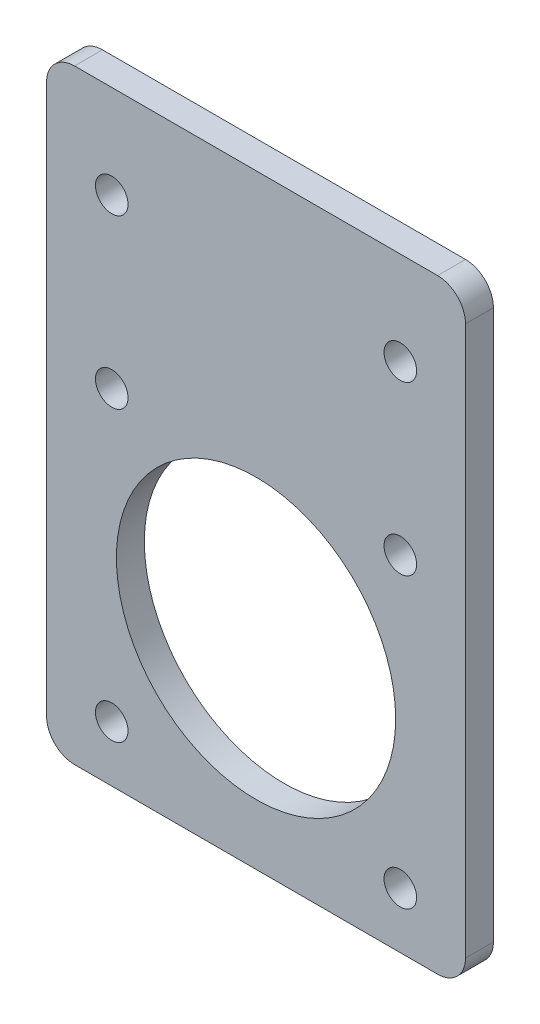
ISO-10303-21;
HEADER;
FILE_DESCRIPTION(('STEP AP214'),'2;1');
FILE_NAME('part.step','',(''),(''),'','','');
FILE_SCHEMA(('AUTOMOTIVE_DESIGN { 1 0 10303 214 1 1 1 1 }'));
ENDSEC;
DATA;
#1=APPLICATION_CONTEXT('core data for automotive mechanical design processes');
#2=APPLICATION_PROTOCOL_DEFINITION('international standard','automotive_design',2000,#1);
#3=PRODUCT_CONTEXT('',#1,'mechanical');
#4=PRODUCT('Part','Part','',(#3));
#5=PRODUCT_RELATED_PRODUCT_CATEGORY('part','',(#4));
#6=PRODUCT_DEFINITION_FORMATION('','',#4);
#7=PRODUCT_DEFINITION_CONTEXT('part definition',#1,'design');
#8=PRODUCT_DEFINITION('design','',#6,#7);
#9=PRODUCT_DEFINITION_SHAPE('','',#8);
#10=(LENGTH_UNIT() NAMED_UNIT(*) SI_UNIT(.MILLI.,.METRE.));
#11=(NAMED_UNIT(*) PLANE_ANGLE_UNIT() SI_UNIT($,.RADIAN.));
#12=(NAMED_UNIT(*) SI_UNIT($,.STERADIAN.) SOLID_ANGLE_UNIT());
#13=UNCERTAINTY_MEASURE_WITH_UNIT(LENGTH_MEASURE(1.E-05),#10,'distance_accuracy_value','');
#14=(GEOMETRIC_REPRESENTATION_CONTEXT(3) GLOBAL_UNCERTAINTY_ASSIGNED_CONTEXT((#13)) GLOBAL_UNIT_ASSIGNED_CONTEXT((#10,
#11,#12)) REPRESENTATION_CONTEXT('',''));
#15=CARTESIAN_POINT('',(0.,0.,0.));
#16=DIRECTION('',(0.,0.,1.));
#17=DIRECTION('',(1.,0.,0.));
#18=AXIS2_PLACEMENT_3D('',#15,#16,#17);
#19=CARTESIAN_POINT('',(-22.5,32.5,3.));
#20=DIRECTION('',(1.,0.,0.));
#21=DIRECTION('',(0.,1.,0.));
#22=AXIS2_PLACEMENT_3D('',#19,#20,#21);
#23=PLANE('',#22);
#24=DIRECTION('',(0.,-1.,0.));
#25=VECTOR('',#24,1.);
#26=CARTESIAN_POINT('',(-22.5,32.5,3.));
#27=LINE('',#26,#25);
#28=CARTESIAN_POINT('',(-22.5,29.5,3.));
#29=VERTEX_POINT('',#28);
#30=CARTESIAN_POINT('',(-22.5,-29.5,3.));
#31=VERTEX_POINT('',#30);
#32=EDGE_CURVE('E122',#29,#31,#27,.T.);
#33=ORIENTED_EDGE('',*,*,#32,.F.);
#34=DIRECTION('',(0.,0.,-1.));
#35=VECTOR('',#34,1.);
#36=CARTESIAN_POINT('',(-22.5,29.5,3.));
#37=LINE('',#36,#35);
#38=CARTESIAN_POINT('',(-22.5,29.5,0.));
#39=VERTEX_POINT('',#38);
#40=EDGE_CURVE('E107',#29,#39,#37,.T.);
#41=ORIENTED_EDGE('',*,*,#40,.T.);
#42=DIRECTION('',(0.,-1.,0.));
#43=VECTOR('',#42,1.);
#44=CARTESIAN_POINT('',(-22.5,32.5,0.));
#45=LINE('',#44,#43);
#46=CARTESIAN_POINT('',(-22.5,-29.5,0.));
#47=VERTEX_POINT('',#46);
#48=EDGE_CURVE('E119',#39,#47,#45,.T.);
#49=ORIENTED_EDGE('',*,*,#48,.T.);
#50=DIRECTION('',(0.,0.,-1.));
#51=VECTOR('',#50,1.);
#52=CARTESIAN_POINT('',(-22.5,-29.5,3.));
#53=LINE('',#52,#51);
#54=EDGE_CURVE('E124',#47,#31,#53,.F.);
#55=ORIENTED_EDGE('',*,*,#54,.T.);
#56=EDGE_LOOP('',(#33,#41,#49,#55));
#57=FACE_BOUND('',#56,.T.);
#58=ADVANCED_FACE('F35',(#57),#23,.F.);
#59=CARTESIAN_POINT('',(22.5,-32.5,3.));
#60=DIRECTION('',(0.,1.,0.));
#61=DIRECTION('',(-1.,0.,0.));
#62=AXIS2_PLACEMENT_3D('',#59,#60,#61);
#63=PLANE('',#62);
#64=DIRECTION('',(1.,0.,0.));
#65=VECTOR('',#64,1.);
#66=CARTESIAN_POINT('',(22.5,-32.5,0.));
#67=LINE('',#66,#65);
#68=CARTESIAN_POINT('',(-19.5,-32.5,0.));
#69=VERTEX_POINT('',#68);
#70=CARTESIAN_POINT('',(19.5,-32.5,0.));
#71=VERTEX_POINT('',#70);
#72=EDGE_CURVE('E128',#69,#71,#67,.T.);
#73=ORIENTED_EDGE('',*,*,#72,.T.);
#74=DIRECTION('',(0.,0.,-1.));
#75=VECTOR('',#74,1.);
#76=CARTESIAN_POINT('',(19.5,-32.5,3.));
#77=LINE('',#76,#75);
#78=CARTESIAN_POINT('',(19.5,-32.5,3.));
#79=VERTEX_POINT('',#78);
#80=EDGE_CURVE('E11',#71,#79,#77,.F.);
#81=ORIENTED_EDGE('',*,*,#80,.T.);
#82=DIRECTION('',(1.,0.,0.));
#83=VECTOR('',#82,1.);
#84=CARTESIAN_POINT('',(22.5,-32.5,3.));
#85=LINE('',#84,#83);
#86=CARTESIAN_POINT('',(-19.5,-32.5,3.));
#87=VERTEX_POINT('',#86);
#88=EDGE_CURVE('E204',#87,#79,#85,.T.);
#89=ORIENTED_EDGE('',*,*,#88,.F.);
#90=DIRECTION('',(0.,0.,-1.));
#91=VECTOR('',#90,1.);
#92=CARTESIAN_POINT('',(-19.5,-32.5,3.));
#93=LINE('',#92,#91);
#94=EDGE_CURVE('E44',#87,#69,#93,.T.);
#95=ORIENTED_EDGE('',*,*,#94,.T.);
#96=EDGE_LOOP('',(#73,#81,#89,#95));
#97=FACE_BOUND('',#96,.T.);
#98=ADVANCED_FACE('F222',(#97),#63,.F.);
#99=CARTESIAN_POINT('',(22.5,32.5,3.));
#100=DIRECTION('',(-1.,0.,0.));
#101=DIRECTION('',(0.,-1.,0.));
#102=AXIS2_PLACEMENT_3D('',#99,#100,#101);
#103=PLANE('',#102);
#104=DIRECTION('',(0.,1.,0.));
#105=VECTOR('',#104,1.);
#106=CARTESIAN_POINT('',(22.5,32.5,0.));
#107=LINE('',#106,#105);
#108=CARTESIAN_POINT('',(22.5,-29.5,0.));
#109=VERTEX_POINT('',#108);
#110=CARTESIAN_POINT('',(22.5,29.5,0.));
#111=VERTEX_POINT('',#110);
#112=EDGE_CURVE('E132',#109,#111,#107,.T.);
#113=ORIENTED_EDGE('',*,*,#112,.T.);
#114=DIRECTION('',(0.,0.,-1.));
#115=VECTOR('',#114,1.);
#116=CARTESIAN_POINT('',(22.5,29.5,3.));
#117=LINE('',#116,#115);
#118=CARTESIAN_POINT('',(22.5,29.5,3.));
#119=VERTEX_POINT('',#118);
#120=EDGE_CURVE('E52',#111,#119,#117,.F.);
#121=ORIENTED_EDGE('',*,*,#120,.T.);
#122=DIRECTION('',(0.,1.,0.));
#123=VECTOR('',#122,1.);
#124=CARTESIAN_POINT('',(22.5,32.5,3.));
#125=LINE('',#124,#123);
#126=CARTESIAN_POINT('',(22.5,-29.5,3.));
#127=VERTEX_POINT('',#126);
#128=EDGE_CURVE('E205',#127,#119,#125,.T.);
#129=ORIENTED_EDGE('',*,*,#128,.F.);
#130=DIRECTION('',(0.,0.,-1.));
#131=VECTOR('',#130,1.);
#132=CARTESIAN_POINT('',(22.5,-29.5,3.));
#133=LINE('',#132,#131);
#134=EDGE_CURVE('E159',#127,#109,#133,.T.);
#135=ORIENTED_EDGE('',*,*,#134,.T.);
#136=EDGE_LOOP('',(#113,#121,#129,#135));
#137=FACE_BOUND('',#136,.T.);
#138=ADVANCED_FACE('F216',(#137),#103,.F.);
#139=CARTESIAN_POINT('',(22.5,32.5,3.));
#140=DIRECTION('',(0.,-1.,0.));
#141=DIRECTION('',(0.,0.,-1.));
#142=AXIS2_PLACEMENT_3D('',#139,#140,#141);
#143=PLANE('',#142);
#144=DIRECTION('',(-1.,0.,0.));
#145=VECTOR('',#144,1.);
#146=CARTESIAN_POINT('',(22.5,32.5,0.));
#147=LINE('',#146,#145);
#148=CARTESIAN_POINT('',(19.5,32.5,0.));
#149=VERTEX_POINT('',#148);
#150=CARTESIAN_POINT('',(-19.5,32.5,0.));
#151=VERTEX_POINT('',#150);
#152=EDGE_CURVE('E142',#149,#151,#147,.T.);
#153=ORIENTED_EDGE('',*,*,#152,.T.);
#154=DIRECTION('',(0.,0.,-1.));
#155=VECTOR('',#154,1.);
#156=CARTESIAN_POINT('',(-19.5,32.5,3.));
#157=LINE('',#156,#155);
#158=CARTESIAN_POINT('',(-19.5,32.5,3.));
#159=VERTEX_POINT('',#158);
#160=EDGE_CURVE('E108',#151,#159,#157,.F.);
#161=ORIENTED_EDGE('',*,*,#160,.T.);
#162=DIRECTION('',(-1.,0.,0.));
#163=VECTOR('',#162,1.);
#164=CARTESIAN_POINT('',(22.5,32.5,3.));
#165=LINE('',#164,#163);
#166=CARTESIAN_POINT('',(19.5,32.5,3.));
#167=VERTEX_POINT('',#166);
#168=EDGE_CURVE('E138',#167,#159,#165,.T.);
#169=ORIENTED_EDGE('',*,*,#168,.F.);
#170=DIRECTION('',(0.,0.,-1.));
#171=VECTOR('',#170,1.);
#172=CARTESIAN_POINT('',(19.5,32.5,3.));
#173=LINE('',#172,#171);
#174=EDGE_CURVE('E113',#167,#149,#173,.T.);
#175=ORIENTED_EDGE('',*,*,#174,.T.);
#176=EDGE_LOOP('',(#153,#161,#169,#175));
#177=FACE_BOUND('',#176,.T.);
#178=ADVANCED_FACE('F212',(#177),#143,.F.);
#179=CARTESIAN_POINT('',(-22.5,-32.5,3.));
#180=DIRECTION('',(0.,0.,-1.));
#181=DIRECTION('',(-1.,0.,0.));
#182=AXIS2_PLACEMENT_3D('',#179,#180,#181);
#183=PLANE('',#182);
#184=CARTESIAN_POINT('',(0.,-11.,3.));
#185=DIRECTION('',(0.,0.,1.));
#186=DIRECTION('',(1.,0.,0.));
#187=AXIS2_PLACEMENT_3D('',#184,#185,#186);
#188=CIRCLE('',#187,15.);
#189=CARTESIAN_POINT('',(15.,-11.,3.));
#190=VERTEX_POINT('',#189);
#191=EDGE_CURVE('E192',#190,#190,#188,.T.);
#192=ORIENTED_EDGE('',*,*,#191,.F.);
#193=EDGE_LOOP('',(#192));
#194=FACE_BOUND('',#193,.T.);
#195=CARTESIAN_POINT('',(-15.5,22.5,3.));
#196=DIRECTION('',(0.,0.,1.));
#197=DIRECTION('',(1.,0.,0.));
#198=AXIS2_PLACEMENT_3D('',#195,#196,#197);
#199=CIRCLE('',#198,1.75);
#200=CARTESIAN_POINT('',(-13.75,22.5,3.));
#201=VERTEX_POINT('',#200);
#202=EDGE_CURVE('E182',#201,#201,#199,.T.);
#203=ORIENTED_EDGE('',*,*,#202,.F.);
#204=EDGE_LOOP('',(#203));
#205=FACE_BOUND('',#204,.T.);
#206=CARTESIAN_POINT('',(15.5,22.5,3.));
#207=DIRECTION('',(0.,0.,1.));
#208=DIRECTION('',(1.,0.,0.));
#209=AXIS2_PLACEMENT_3D('',#206,#207,#208);
#210=CIRCLE('',#209,1.75);
#211=CARTESIAN_POINT('',(17.25,22.5,3.));
#212=VERTEX_POINT('',#211);
#213=EDGE_CURVE('E179',#212,#212,#210,.T.);
#214=ORIENTED_EDGE('',*,*,#213,.F.);
#215=EDGE_LOOP('',(#214));
#216=FACE_BOUND('',#215,.T.);
#217=CARTESIAN_POINT('',(15.5,-26.5,3.));
#218=DIRECTION('',(0.,0.,1.));
#219=DIRECTION('',(1.,0.,0.));
#220=AXIS2_PLACEMENT_3D('',#217,#218,#219);
#221=CIRCLE('',#220,1.75);
#222=CARTESIAN_POINT('',(17.25,-26.5,3.));
#223=VERTEX_POINT('',#222);
#224=EDGE_CURVE('E176',#223,#223,#221,.T.);
#225=ORIENTED_EDGE('',*,*,#224,.F.);
#226=EDGE_LOOP('',(#225));
#227=FACE_BOUND('',#226,.T.);
#228=CARTESIAN_POINT('',(15.5,4.5,3.));
#229=DIRECTION('',(0.,0.,1.));
#230=DIRECTION('',(1.,0.,0.));
#231=AXIS2_PLACEMENT_3D('',#228,#229,#230);
#232=CIRCLE('',#231,1.75);
#233=CARTESIAN_POINT('',(17.25,4.5,3.));
#234=VERTEX_POINT('',#233);
#235=EDGE_CURVE('E172',#234,#234,#232,.T.);
#236=ORIENTED_EDGE('',*,*,#235,.F.);
#237=EDGE_LOOP('',(#236));
#238=FACE_BOUND('',#237,.T.);
#239=CARTESIAN_POINT('',(-15.5,4.5,3.));
#240=DIRECTION('',(0.,0.,1.));
#241=DIRECTION('',(1.,0.,0.));
#242=AXIS2_PLACEMENT_3D('',#239,#240,#241);
#243=CIRCLE('',#242,1.75);
#244=CARTESIAN_POINT('',(-13.75,4.5,3.));
#245=VERTEX_POINT('',#244);
#246=EDGE_CURVE('E168',#245,#245,#243,.T.);
#247=ORIENTED_EDGE('',*,*,#246,.F.);
#248=EDGE_LOOP('',(#247));
#249=FACE_BOUND('',#248,.T.);
#250=CARTESIAN_POINT('',(-15.5,-26.5,3.));
#251=DIRECTION('',(0.,0.,1.));
#252=DIRECTION('',(1.,0.,0.));
#253=AXIS2_PLACEMENT_3D('',#250,#251,#252);
#254=CIRCLE('',#253,1.75);
#255=CARTESIAN_POINT('',(-13.75,-26.5,3.));
#256=VERTEX_POINT('',#255);
#257=EDGE_CURVE('E135',#256,#256,#254,.T.);
#258=ORIENTED_EDGE('',*,*,#257,.F.);
#259=EDGE_LOOP('',(#258));
#260=FACE_BOUND('',#259,.T.);
#261=ORIENTED_EDGE('',*,*,#168,.T.);
#262=CARTESIAN_POINT('',(-19.5,29.5,3.));
#263=DIRECTION('',(0.,0.,-1.));
#264=DIRECTION('',(-1.,0.,0.));
#265=AXIS2_PLACEMENT_3D('',#262,#263,#264);
#266=CIRCLE('',#265,3.);
#267=EDGE_CURVE('E157',#159,#29,#266,.F.);
#268=ORIENTED_EDGE('',*,*,#267,.T.);
#269=ORIENTED_EDGE('',*,*,#32,.T.);
#270=CARTESIAN_POINT('',(-19.5,-29.5,3.));
#271=DIRECTION('',(0.,0.,-1.));
#272=DIRECTION('',(-1.,0.,0.));
#273=AXIS2_PLACEMENT_3D('',#270,#271,#272);
#274=CIRCLE('',#273,3.);
#275=EDGE_CURVE('E152',#31,#87,#274,.F.);
#276=ORIENTED_EDGE('',*,*,#275,.T.);
#277=ORIENTED_EDGE('',*,*,#88,.T.);
#278=CARTESIAN_POINT('',(19.5,-29.5,3.));
#279=DIRECTION('',(0.,0.,-1.));
#280=DIRECTION('',(-1.,0.,0.));
#281=AXIS2_PLACEMENT_3D('',#278,#279,#280);
#282=CIRCLE('',#281,3.);
#283=EDGE_CURVE('E59',#79,#127,#282,.F.);
#284=ORIENTED_EDGE('',*,*,#283,.T.);
#285=ORIENTED_EDGE('',*,*,#128,.T.);
#286=CARTESIAN_POINT('',(19.5,29.5,3.));
#287=DIRECTION('',(0.,0.,-1.));
#288=DIRECTION('',(-1.,0.,0.));
#289=AXIS2_PLACEMENT_3D('',#286,#287,#288);
#290=CIRCLE('',#289,3.);
#291=EDGE_CURVE('E155',#119,#167,#290,.F.);
#292=ORIENTED_EDGE('',*,*,#291,.T.);
#293=EDGE_LOOP('',(#261,#268,#269,#276,#277,#284,#285,#292));
#294=FACE_BOUND('',#293,.T.);
#295=ADVANCED_FACE('F209',(#194,#205,#216,#227,#238,#249,#260,#294),#183,.F.);
#296=CARTESIAN_POINT('',(-22.5,-32.5,0.));
#297=DIRECTION('',(0.,0.,-1.));
#298=DIRECTION('',(-1.,0.,0.));
#299=AXIS2_PLACEMENT_3D('',#296,#297,#298);
#300=PLANE('',#299);
#301=CARTESIAN_POINT('',(0.,-11.,0.));
#302=DIRECTION('',(0.,0.,-1.));
#303=DIRECTION('',(-1.,0.,0.));
#304=AXIS2_PLACEMENT_3D('',#301,#302,#303);
#305=CIRCLE('',#304,15.);
#306=CARTESIAN_POINT('',(-15.,-11.,0.));
#307=VERTEX_POINT('',#306);
#308=EDGE_CURVE('E39',#307,#307,#305,.T.);
#309=ORIENTED_EDGE('',*,*,#308,.F.);
#310=EDGE_LOOP('',(#309));
#311=FACE_BOUND('',#310,.T.);
#312=CARTESIAN_POINT('',(-15.5,22.5,0.));
#313=DIRECTION('',(0.,0.,-1.));
#314=DIRECTION('',(-1.,0.,0.));
#315=AXIS2_PLACEMENT_3D('',#312,#313,#314);
#316=CIRCLE('',#315,1.75);
#317=CARTESIAN_POINT('',(-17.25,22.5,0.));
#318=VERTEX_POINT('',#317);
#319=EDGE_CURVE('E180',#318,#318,#316,.T.);
#320=ORIENTED_EDGE('',*,*,#319,.F.);
#321=EDGE_LOOP('',(#320));
#322=FACE_BOUND('',#321,.T.);
#323=CARTESIAN_POINT('',(15.5,22.5,0.));
#324=DIRECTION('',(0.,0.,-1.));
#325=DIRECTION('',(-1.,0.,0.));
#326=AXIS2_PLACEMENT_3D('',#323,#324,#325);
#327=CIRCLE('',#326,1.75);
#328=CARTESIAN_POINT('',(13.75,22.5,0.));
#329=VERTEX_POINT('',#328);
#330=EDGE_CURVE('E177',#329,#329,#327,.T.);
#331=ORIENTED_EDGE('',*,*,#330,.F.);
#332=EDGE_LOOP('',(#331));
#333=FACE_BOUND('',#332,.T.);
#334=CARTESIAN_POINT('',(15.5,-26.5,0.));
#335=DIRECTION('',(0.,0.,-1.));
#336=DIRECTION('',(-1.,0.,0.));
#337=AXIS2_PLACEMENT_3D('',#334,#335,#336);
#338=CIRCLE('',#337,1.75);
#339=CARTESIAN_POINT('',(13.75,-26.5,0.));
#340=VERTEX_POINT('',#339);
#341=EDGE_CURVE('E173',#340,#340,#338,.T.);
#342=ORIENTED_EDGE('',*,*,#341,.F.);
#343=EDGE_LOOP('',(#342));
#344=FACE_BOUND('',#343,.T.);
#345=CARTESIAN_POINT('',(15.5,4.5,0.));
#346=DIRECTION('',(0.,0.,-1.));
#347=DIRECTION('',(-1.,0.,0.));
#348=AXIS2_PLACEMENT_3D('',#345,#346,#347);
#349=CIRCLE('',#348,1.75);
#350=CARTESIAN_POINT('',(13.75,4.5,0.));
#351=VERTEX_POINT('',#350);
#352=EDGE_CURVE('E169',#351,#351,#349,.T.);
#353=ORIENTED_EDGE('',*,*,#352,.F.);
#354=EDGE_LOOP('',(#353));
#355=FACE_BOUND('',#354,.T.);
#356=CARTESIAN_POINT('',(-15.5,4.5,0.));
#357=DIRECTION('',(0.,0.,-1.));
#358=DIRECTION('',(-1.,0.,0.));
#359=AXIS2_PLACEMENT_3D('',#356,#357,#358);
#360=CIRCLE('',#359,1.75);
#361=CARTESIAN_POINT('',(-17.25,4.5,0.));
#362=VERTEX_POINT('',#361);
#363=EDGE_CURVE('E165',#362,#362,#360,.T.);
#364=ORIENTED_EDGE('',*,*,#363,.F.);
#365=EDGE_LOOP('',(#364));
#366=FACE_BOUND('',#365,.T.);
#367=CARTESIAN_POINT('',(-15.5,-26.5,0.));
#368=DIRECTION('',(0.,0.,-1.));
#369=DIRECTION('',(-1.,0.,0.));
#370=AXIS2_PLACEMENT_3D('',#367,#368,#369);
#371=CIRCLE('',#370,1.75);
#372=CARTESIAN_POINT('',(-17.25,-26.5,0.));
#373=VERTEX_POINT('',#372);
#374=EDGE_CURVE('E129',#373,#373,#371,.T.);
#375=ORIENTED_EDGE('',*,*,#374,.F.);
#376=EDGE_LOOP('',(#375));
#377=FACE_BOUND('',#376,.T.);
#378=ORIENTED_EDGE('',*,*,#48,.F.);
#379=CARTESIAN_POINT('',(-19.5,29.5,0.));
#380=DIRECTION('',(0.,0.,-1.));
#381=DIRECTION('',(-1.,0.,0.));
#382=AXIS2_PLACEMENT_3D('',#379,#380,#381);
#383=CIRCLE('',#382,3.);
#384=EDGE_CURVE('E103',#39,#151,#383,.T.);
#385=ORIENTED_EDGE('',*,*,#384,.T.);
#386=ORIENTED_EDGE('',*,*,#152,.F.);
#387=CARTESIAN_POINT('',(19.5,29.5,0.));
#388=DIRECTION('',(0.,0.,-1.));
#389=DIRECTION('',(-1.,0.,0.));
#390=AXIS2_PLACEMENT_3D('',#387,#388,#389);
#391=CIRCLE('',#390,3.);
#392=EDGE_CURVE('E114',#149,#111,#391,.T.);
#393=ORIENTED_EDGE('',*,*,#392,.T.);
#394=ORIENTED_EDGE('',*,*,#112,.F.);
#395=CARTESIAN_POINT('',(19.5,-29.5,0.));
#396=DIRECTION('',(0.,0.,-1.));
#397=DIRECTION('',(-1.,0.,0.));
#398=AXIS2_PLACEMENT_3D('',#395,#396,#397);
#399=CIRCLE('',#398,3.);
#400=EDGE_CURVE('E146',#109,#71,#399,.T.);
#401=ORIENTED_EDGE('',*,*,#400,.T.);
#402=ORIENTED_EDGE('',*,*,#72,.F.);
#403=CARTESIAN_POINT('',(-19.5,-29.5,0.));
#404=DIRECTION('',(0.,0.,-1.));
#405=DIRECTION('',(-1.,0.,0.));
#406=AXIS2_PLACEMENT_3D('',#403,#404,#405);
#407=CIRCLE('',#406,3.);
#408=EDGE_CURVE('E123',#69,#47,#407,.T.);
#409=ORIENTED_EDGE('',*,*,#408,.T.);
#410=EDGE_LOOP('',(#378,#385,#386,#393,#394,#401,#402,#409));
#411=FACE_BOUND('',#410,.T.);
#412=ADVANCED_FACE('F126',(#311,#322,#333,#344,#355,#366,#377,#411),#300,.T.);
#413=CARTESIAN_POINT('',(-19.5,29.5,3.));
#414=DIRECTION('',(0.,0.,-1.));
#415=DIRECTION('',(-1.,0.,0.));
#416=AXIS2_PLACEMENT_3D('',#413,#414,#415);
#417=CYLINDRICAL_SURFACE('',#416,3.);
#418=ORIENTED_EDGE('',*,*,#267,.F.);
#419=ORIENTED_EDGE('',*,*,#160,.F.);
#420=ORIENTED_EDGE('',*,*,#384,.F.);
#421=ORIENTED_EDGE('',*,*,#40,.F.);
#422=EDGE_LOOP('',(#418,#419,#420,#421));
#423=FACE_BOUND('',#422,.T.);
#424=ADVANCED_FACE('F106',(#423),#417,.T.);
#425=CARTESIAN_POINT('',(19.5,29.5,3.));
#426=DIRECTION('',(0.,0.,-1.));
#427=DIRECTION('',(-1.,0.,0.));
#428=AXIS2_PLACEMENT_3D('',#425,#426,#427);
#429=CYLINDRICAL_SURFACE('',#428,3.);
#430=ORIENTED_EDGE('',*,*,#291,.F.);
#431=ORIENTED_EDGE('',*,*,#120,.F.);
#432=ORIENTED_EDGE('',*,*,#392,.F.);
#433=ORIENTED_EDGE('',*,*,#174,.F.);
#434=EDGE_LOOP('',(#430,#431,#432,#433));
#435=FACE_BOUND('',#434,.T.);
#436=ADVANCED_FACE('F214',(#435),#429,.T.);
#437=CARTESIAN_POINT('',(19.5,-29.5,3.));
#438=DIRECTION('',(0.,0.,-1.));
#439=DIRECTION('',(-1.,0.,0.));
#440=AXIS2_PLACEMENT_3D('',#437,#438,#439);
#441=CYLINDRICAL_SURFACE('',#440,3.);
#442=ORIENTED_EDGE('',*,*,#283,.F.);
#443=ORIENTED_EDGE('',*,*,#80,.F.);
#444=ORIENTED_EDGE('',*,*,#400,.F.);
#445=ORIENTED_EDGE('',*,*,#134,.F.);
#446=EDGE_LOOP('',(#442,#443,#444,#445));
#447=FACE_BOUND('',#446,.T.);
#448=ADVANCED_FACE('F219',(#447),#441,.T.);
#449=CARTESIAN_POINT('',(-19.5,-29.5,3.));
#450=DIRECTION('',(0.,0.,-1.));
#451=DIRECTION('',(-1.,0.,0.));
#452=AXIS2_PLACEMENT_3D('',#449,#450,#451);
#453=CYLINDRICAL_SURFACE('',#452,3.);
#454=ORIENTED_EDGE('',*,*,#275,.F.);
#455=ORIENTED_EDGE('',*,*,#54,.F.);
#456=ORIENTED_EDGE('',*,*,#408,.F.);
#457=ORIENTED_EDGE('',*,*,#94,.F.);
#458=EDGE_LOOP('',(#454,#455,#456,#457));
#459=FACE_BOUND('',#458,.T.);
#460=ADVANCED_FACE('F37',(#459),#453,.T.);
#461=CARTESIAN_POINT('',(-15.5,-26.5,-9.));
#462=DIRECTION('',(0.,0.,1.));
#463=DIRECTION('',(1.,0.,0.));
#464=AXIS2_PLACEMENT_3D('',#461,#462,#463);
#465=CYLINDRICAL_SURFACE('',#464,1.75);
#466=ORIENTED_EDGE('',*,*,#374,.T.);
#467=EDGE_LOOP('',(#466));
#468=FACE_BOUND('',#467,.T.);
#469=ORIENTED_EDGE('',*,*,#257,.T.);
#470=EDGE_LOOP('',(#469));
#471=FACE_BOUND('',#470,.T.);
#472=ADVANCED_FACE('F228',(#468,#471),#465,.F.);
#473=CARTESIAN_POINT('',(-15.5,4.5,-9.));
#474=DIRECTION('',(0.,0.,1.));
#475=DIRECTION('',(1.,0.,0.));
#476=AXIS2_PLACEMENT_3D('',#473,#474,#475);
#477=CYLINDRICAL_SURFACE('',#476,1.75);
#478=ORIENTED_EDGE('',*,*,#363,.T.);
#479=EDGE_LOOP('',(#478));
#480=FACE_BOUND('',#479,.T.);
#481=ORIENTED_EDGE('',*,*,#246,.T.);
#482=EDGE_LOOP('',(#481));
#483=FACE_BOUND('',#482,.T.);
#484=ADVANCED_FACE('F233',(#480,#483),#477,.F.);
#485=CARTESIAN_POINT('',(15.5,4.5,-9.));
#486=DIRECTION('',(0.,0.,1.));
#487=DIRECTION('',(1.,0.,0.));
#488=AXIS2_PLACEMENT_3D('',#485,#486,#487);
#489=CYLINDRICAL_SURFACE('',#488,1.75);
#490=ORIENTED_EDGE('',*,*,#352,.T.);
#491=EDGE_LOOP('',(#490));
#492=FACE_BOUND('',#491,.T.);
#493=ORIENTED_EDGE('',*,*,#235,.T.);
#494=EDGE_LOOP('',(#493));
#495=FACE_BOUND('',#494,.T.);
#496=ADVANCED_FACE('F295',(#492,#495),#489,.F.);
#497=CARTESIAN_POINT('',(15.5,-26.5,-9.));
#498=DIRECTION('',(0.,0.,1.));
#499=DIRECTION('',(1.,0.,0.));
#500=AXIS2_PLACEMENT_3D('',#497,#498,#499);
#501=CYLINDRICAL_SURFACE('',#500,1.75);
#502=ORIENTED_EDGE('',*,*,#341,.T.);
#503=EDGE_LOOP('',(#502));
#504=FACE_BOUND('',#503,.T.);
#505=ORIENTED_EDGE('',*,*,#224,.T.);
#506=EDGE_LOOP('',(#505));
#507=FACE_BOUND('',#506,.T.);
#508=ADVANCED_FACE('F305',(#504,#507),#501,.F.);
#509=CARTESIAN_POINT('',(15.5,22.5,-9.));
#510=DIRECTION('',(0.,0.,1.));
#511=DIRECTION('',(1.,0.,0.));
#512=AXIS2_PLACEMENT_3D('',#509,#510,#511);
#513=CYLINDRICAL_SURFACE('',#512,1.75);
#514=ORIENTED_EDGE('',*,*,#330,.T.);
#515=EDGE_LOOP('',(#514));
#516=FACE_BOUND('',#515,.T.);
#517=ORIENTED_EDGE('',*,*,#213,.T.);
#518=EDGE_LOOP('',(#517));
#519=FACE_BOUND('',#518,.T.);
#520=ADVANCED_FACE('F315',(#516,#519),#513,.F.);
#521=CARTESIAN_POINT('',(-15.5,22.5,-9.));
#522=DIRECTION('',(0.,0.,1.));
#523=DIRECTION('',(1.,0.,0.));
#524=AXIS2_PLACEMENT_3D('',#521,#522,#523);
#525=CYLINDRICAL_SURFACE('',#524,1.75);
#526=ORIENTED_EDGE('',*,*,#319,.T.);
#527=EDGE_LOOP('',(#526));
#528=FACE_BOUND('',#527,.T.);
#529=ORIENTED_EDGE('',*,*,#202,.T.);
#530=EDGE_LOOP('',(#529));
#531=FACE_BOUND('',#530,.T.);
#532=ADVANCED_FACE('F325',(#528,#531),#525,.F.);
#533=CARTESIAN_POINT('',(0.,-11.,-9.));
#534=DIRECTION('',(0.,0.,1.));
#535=DIRECTION('',(1.,0.,0.));
#536=AXIS2_PLACEMENT_3D('',#533,#534,#535);
#537=CYLINDRICAL_SURFACE('',#536,15.);
#538=ORIENTED_EDGE('',*,*,#308,.T.);
#539=EDGE_LOOP('',(#538));
#540=FACE_BOUND('',#539,.T.);
#541=ORIENTED_EDGE('',*,*,#191,.T.);
#542=EDGE_LOOP('',(#541));
#543=FACE_BOUND('',#542,.T.);
#544=ADVANCED_FACE('F335',(#540,#543),#537,.F.);
#545=CLOSED_SHELL('',(#58,#98,#138,#178,#295,#412,#424,#436,#448,#460,#472,#484,#496,#508,#520,
#532,#544));
#546=MANIFOLD_SOLID_BREP('B2',#545);
#547=ADVANCED_BREP_SHAPE_REPRESENTATION('',(#18,#546),#14);
#548=SHAPE_DEFINITION_REPRESENTATION(#9,#547);
ENDSEC;
END-ISO-10303-21;
